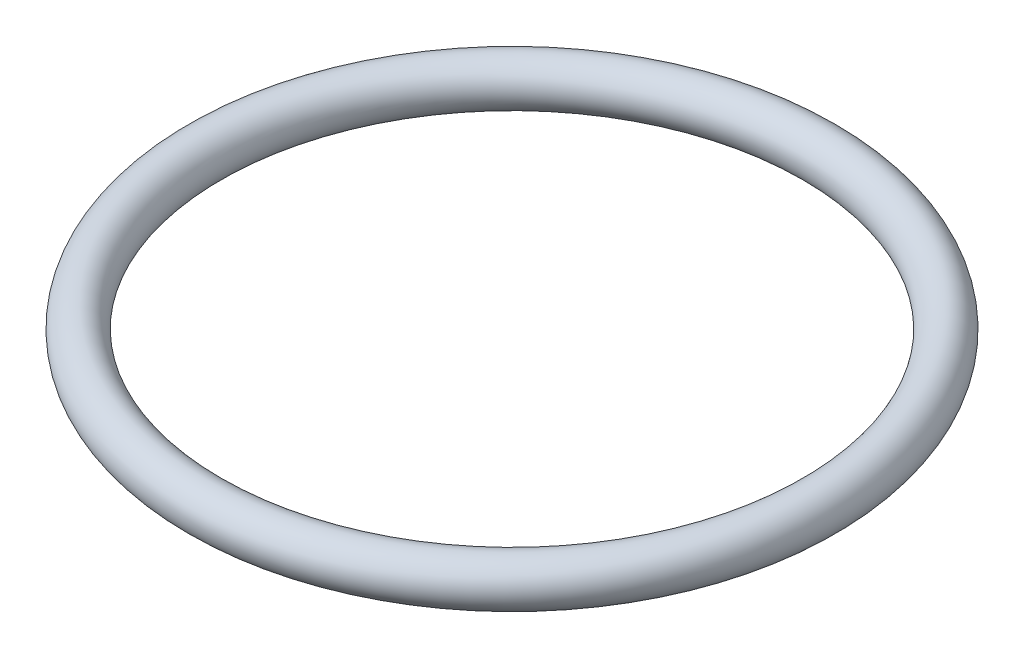
ISO-10303-21;
HEADER;
FILE_DESCRIPTION(('STEP AP214'),'2;1');
FILE_NAME('part.step','',(''),(''),'','','');
FILE_SCHEMA(('AUTOMOTIVE_DESIGN { 1 0 10303 214 1 1 1 1 }'));
ENDSEC;
DATA;
#1=APPLICATION_CONTEXT('core data for automotive mechanical design processes');
#2=APPLICATION_PROTOCOL_DEFINITION('international standard','automotive_design',2000,#1);
#3=PRODUCT_CONTEXT('',#1,'mechanical');
#4=PRODUCT('Part','Part','',(#3));
#5=PRODUCT_RELATED_PRODUCT_CATEGORY('part','',(#4));
#6=PRODUCT_DEFINITION_FORMATION('','',#4);
#7=PRODUCT_DEFINITION_CONTEXT('part definition',#1,'design');
#8=PRODUCT_DEFINITION('design','',#6,#7);
#9=PRODUCT_DEFINITION_SHAPE('','',#8);
#10=(LENGTH_UNIT() NAMED_UNIT(*) SI_UNIT(.MILLI.,.METRE.));
#11=(NAMED_UNIT(*) PLANE_ANGLE_UNIT() SI_UNIT($,.RADIAN.));
#12=(NAMED_UNIT(*) SI_UNIT($,.STERADIAN.) SOLID_ANGLE_UNIT());
#13=UNCERTAINTY_MEASURE_WITH_UNIT(LENGTH_MEASURE(1.E-05),#10,'distance_accuracy_value','');
#14=(GEOMETRIC_REPRESENTATION_CONTEXT(3) GLOBAL_UNCERTAINTY_ASSIGNED_CONTEXT((#13)) GLOBAL_UNIT_ASSIGNED_CONTEXT((#10,
#11,#12)) REPRESENTATION_CONTEXT('',''));
#15=CARTESIAN_POINT('',(0.,0.,0.));
#16=DIRECTION('',(0.,0.,1.));
#17=DIRECTION('',(1.,0.,0.));
#18=AXIS2_PLACEMENT_3D('',#15,#16,#17);
#19=CARTESIAN_POINT('',(0.,0.,0.));
#20=DIRECTION('',(0.,-1.,0.));
#21=DIRECTION('',(0.,0.,-1.));
#22=AXIS2_PLACEMENT_3D('',#19,#20,#21);
#23=TOROIDAL_SURFACE('',#22,23.8125,1.7653);
#24=CARTESIAN_POINT('',(0.,0.,-25.5778));
#25=VERTEX_POINT('',#24);
#26=VERTEX_LOOP('',#25);
#27=FACE_BOUND('',#26,.T.);
#28=ADVANCED_FACE('F29',(#27),#23,.T.);
#29=CLOSED_SHELL('',(#28));
#30=MANIFOLD_SOLID_BREP('B2',#29);
#31=ADVANCED_BREP_SHAPE_REPRESENTATION('',(#18,#30),#14);
#32=SHAPE_DEFINITION_REPRESENTATION(#9,#31);
ENDSEC;
END-ISO-10303-21;
